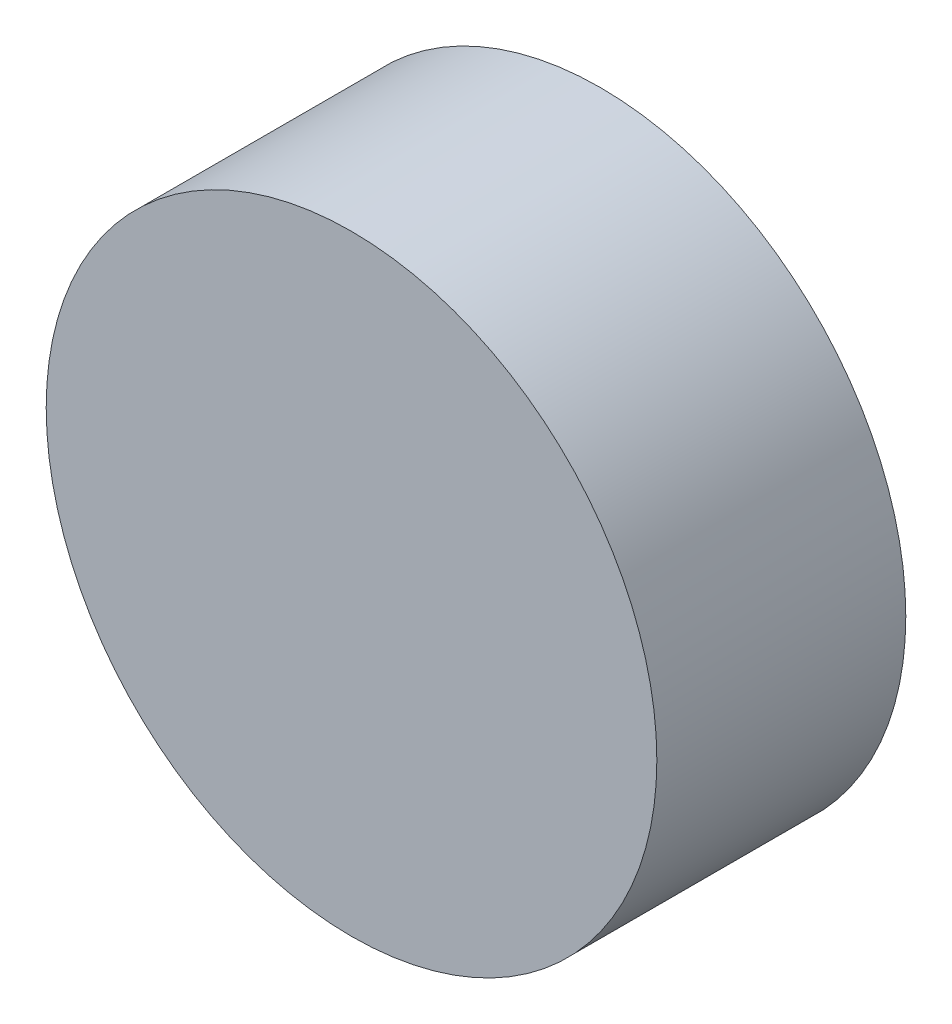
ISO-10303-21;
HEADER;
FILE_DESCRIPTION(('STEP AP214'),'2;1');
FILE_NAME('part.step','',(''),(''),'','','');
FILE_SCHEMA(('AUTOMOTIVE_DESIGN { 1 0 10303 214 1 1 1 1 }'));
ENDSEC;
DATA;
#1=APPLICATION_CONTEXT('core data for automotive mechanical design processes');
#2=APPLICATION_PROTOCOL_DEFINITION('international standard','automotive_design',2000,#1);
#3=PRODUCT_CONTEXT('',#1,'mechanical');
#4=PRODUCT('Part','Part','',(#3));
#5=PRODUCT_RELATED_PRODUCT_CATEGORY('part','',(#4));
#6=PRODUCT_DEFINITION_FORMATION('','',#4);
#7=PRODUCT_DEFINITION_CONTEXT('part definition',#1,'design');
#8=PRODUCT_DEFINITION('design','',#6,#7);
#9=PRODUCT_DEFINITION_SHAPE('','',#8);
#10=(LENGTH_UNIT() NAMED_UNIT(*) SI_UNIT(.MILLI.,.METRE.));
#11=(NAMED_UNIT(*) PLANE_ANGLE_UNIT() SI_UNIT($,.RADIAN.));
#12=(NAMED_UNIT(*) SI_UNIT($,.STERADIAN.) SOLID_ANGLE_UNIT());
#13=UNCERTAINTY_MEASURE_WITH_UNIT(LENGTH_MEASURE(1.E-05),#10,'distance_accuracy_value','');
#14=(GEOMETRIC_REPRESENTATION_CONTEXT(3) GLOBAL_UNCERTAINTY_ASSIGNED_CONTEXT((#13)) GLOBAL_UNIT_ASSIGNED_CONTEXT((#10,
#11,#12)) REPRESENTATION_CONTEXT('',''));
#15=CARTESIAN_POINT('',(0.,0.,0.));
#16=DIRECTION('',(0.,0.,1.));
#17=DIRECTION('',(1.,0.,0.));
#18=AXIS2_PLACEMENT_3D('',#15,#16,#17);
#19=CARTESIAN_POINT('',(0.,0.,26.5));
#20=DIRECTION('',(0.,0.,-1.));
#21=DIRECTION('',(-1.,0.,0.));
#22=AXIS2_PLACEMENT_3D('',#19,#20,#21);
#23=CYLINDRICAL_SURFACE('',#22,32.5);
#24=CARTESIAN_POINT('',(0.,0.,26.5));
#25=DIRECTION('',(0.,0.,1.));
#26=DIRECTION('',(1.,0.,0.));
#27=AXIS2_PLACEMENT_3D('',#24,#25,#26);
#28=CIRCLE('',#27,32.5);
#29=CARTESIAN_POINT('',(32.5,0.,26.5));
#30=VERTEX_POINT('',#29);
#31=EDGE_CURVE('E10',#30,#30,#28,.T.);
#32=ORIENTED_EDGE('',*,*,#31,.F.);
#33=EDGE_LOOP('',(#32));
#34=FACE_BOUND('',#33,.T.);
#35=CARTESIAN_POINT('',(0.,0.,0.));
#36=DIRECTION('',(0.,0.,1.));
#37=DIRECTION('',(1.,0.,0.));
#38=AXIS2_PLACEMENT_3D('',#35,#36,#37);
#39=CIRCLE('',#38,32.5);
#40=CARTESIAN_POINT('',(32.5,0.,0.));
#41=VERTEX_POINT('',#40);
#42=EDGE_CURVE('E36',#41,#41,#39,.T.);
#43=ORIENTED_EDGE('',*,*,#42,.T.);
#44=EDGE_LOOP('',(#43));
#45=FACE_BOUND('',#44,.T.);
#46=ADVANCED_FACE('F33',(#34,#45),#23,.T.);
#47=CARTESIAN_POINT('',(0.,0.,26.5));
#48=DIRECTION('',(0.,0.,1.));
#49=DIRECTION('',(1.,0.,0.));
#50=AXIS2_PLACEMENT_3D('',#47,#48,#49);
#51=PLANE('',#50);
#52=ORIENTED_EDGE('',*,*,#31,.T.);
#53=EDGE_LOOP('',(#52));
#54=FACE_BOUND('',#53,.T.);
#55=ADVANCED_FACE('F48',(#54),#51,.T.);
#56=CARTESIAN_POINT('',(0.,0.,0.));
#57=DIRECTION('',(0.,0.,1.));
#58=DIRECTION('',(1.,0.,0.));
#59=AXIS2_PLACEMENT_3D('',#56,#57,#58);
#60=PLANE('',#59);
#61=ORIENTED_EDGE('',*,*,#42,.F.);
#62=EDGE_LOOP('',(#61));
#63=FACE_BOUND('',#62,.T.);
#64=ADVANCED_FACE('F46',(#63),#60,.F.);
#65=CLOSED_SHELL('',(#46,#55,#64));
#66=MANIFOLD_SOLID_BREP('B2',#65);
#67=ADVANCED_BREP_SHAPE_REPRESENTATION('',(#18,#66),#14);
#68=SHAPE_DEFINITION_REPRESENTATION(#9,#67);
ENDSEC;
END-ISO-10303-21;
